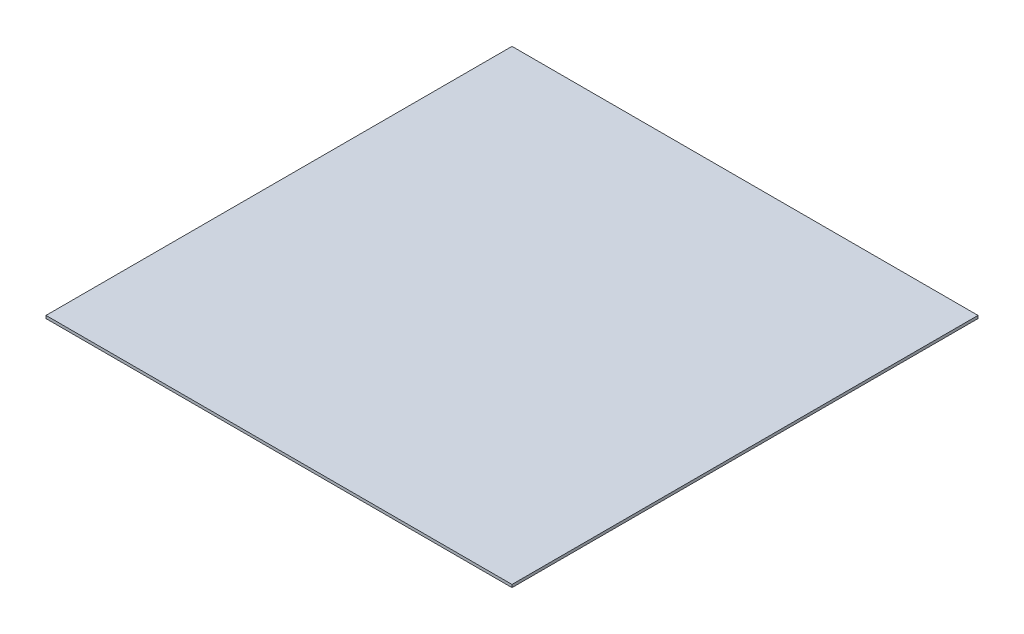
ISO-10303-21;
HEADER;
FILE_DESCRIPTION(('STEP AP214'),'2;1');
FILE_NAME('part.step','',(''),(''),'','','');
FILE_SCHEMA(('AUTOMOTIVE_DESIGN { 1 0 10303 214 1 1 1 1 }'));
ENDSEC;
DATA;
#1=APPLICATION_CONTEXT('core data for automotive mechanical design processes');
#2=APPLICATION_PROTOCOL_DEFINITION('international standard','automotive_design',2000,#1);
#3=PRODUCT_CONTEXT('',#1,'mechanical');
#4=PRODUCT('Part','Part','',(#3));
#5=PRODUCT_RELATED_PRODUCT_CATEGORY('part','',(#4));
#6=PRODUCT_DEFINITION_FORMATION('','',#4);
#7=PRODUCT_DEFINITION_CONTEXT('part definition',#1,'design');
#8=PRODUCT_DEFINITION('design','',#6,#7);
#9=PRODUCT_DEFINITION_SHAPE('','',#8);
#10=(LENGTH_UNIT() NAMED_UNIT(*) SI_UNIT(.MILLI.,.METRE.));
#11=(NAMED_UNIT(*) PLANE_ANGLE_UNIT() SI_UNIT($,.RADIAN.));
#12=(NAMED_UNIT(*) SI_UNIT($,.STERADIAN.) SOLID_ANGLE_UNIT());
#13=UNCERTAINTY_MEASURE_WITH_UNIT(LENGTH_MEASURE(1.E-05),#10,'distance_accuracy_value','');
#14=(GEOMETRIC_REPRESENTATION_CONTEXT(3) GLOBAL_UNCERTAINTY_ASSIGNED_CONTEXT((#13)) GLOBAL_UNIT_ASSIGNED_CONTEXT((#10,
#11,#12)) REPRESENTATION_CONTEXT('',''));
#15=CARTESIAN_POINT('',(0.,0.,0.));
#16=DIRECTION('',(0.,0.,1.));
#17=DIRECTION('',(1.,0.,0.));
#18=AXIS2_PLACEMENT_3D('',#15,#16,#17);
#19=CARTESIAN_POINT('',(125.,0.75,125.));
#20=DIRECTION('',(-1.,0.,0.));
#21=DIRECTION('',(0.,0.,1.));
#22=AXIS2_PLACEMENT_3D('',#19,#20,#21);
#23=PLANE('',#22);
#24=DIRECTION('',(0.,0.,-1.));
#25=VECTOR('',#24,1.);
#26=CARTESIAN_POINT('',(125.,-0.75,125.));
#27=LINE('',#26,#25);
#28=CARTESIAN_POINT('',(125.,-0.75,125.));
#29=VERTEX_POINT('',#28);
#30=CARTESIAN_POINT('',(125.,-0.75,-125.));
#31=VERTEX_POINT('',#30);
#32=EDGE_CURVE('E107',#29,#31,#27,.T.);
#33=ORIENTED_EDGE('',*,*,#32,.T.);
#34=DIRECTION('',(0.,-1.,0.));
#35=VECTOR('',#34,1.);
#36=CARTESIAN_POINT('',(125.,0.75,-125.));
#37=LINE('',#36,#35);
#38=CARTESIAN_POINT('',(125.,0.75,-125.));
#39=VERTEX_POINT('',#38);
#40=EDGE_CURVE('E11',#39,#31,#37,.T.);
#41=ORIENTED_EDGE('',*,*,#40,.F.);
#42=DIRECTION('',(0.,0.,-1.));
#43=VECTOR('',#42,1.);
#44=CARTESIAN_POINT('',(125.,0.75,125.));
#45=LINE('',#44,#43);
#46=CARTESIAN_POINT('',(125.,0.75,125.));
#47=VERTEX_POINT('',#46);
#48=EDGE_CURVE('E91',#47,#39,#45,.T.);
#49=ORIENTED_EDGE('',*,*,#48,.F.);
#50=DIRECTION('',(0.,-1.,0.));
#51=VECTOR('',#50,1.);
#52=CARTESIAN_POINT('',(125.,0.75,125.));
#53=LINE('',#52,#51);
#54=EDGE_CURVE('E103',#47,#29,#53,.T.);
#55=ORIENTED_EDGE('',*,*,#54,.T.);
#56=EDGE_LOOP('',(#33,#41,#49,#55));
#57=FACE_BOUND('',#56,.T.);
#58=ADVANCED_FACE('F39',(#57),#23,.F.);
#59=CARTESIAN_POINT('',(-125.,0.75,-125.));
#60=DIRECTION('',(0.,0.,1.));
#61=DIRECTION('',(1.,0.,0.));
#62=AXIS2_PLACEMENT_3D('',#59,#60,#61);
#63=PLANE('',#62);
#64=DIRECTION('',(-1.,0.,0.));
#65=VECTOR('',#64,1.);
#66=CARTESIAN_POINT('',(-125.,-0.75,-125.));
#67=LINE('',#66,#65);
#68=CARTESIAN_POINT('',(-125.,-0.75,-125.));
#69=VERTEX_POINT('',#68);
#70=EDGE_CURVE('E96',#31,#69,#67,.T.);
#71=ORIENTED_EDGE('',*,*,#70,.T.);
#72=DIRECTION('',(0.,-1.,0.));
#73=VECTOR('',#72,1.);
#74=CARTESIAN_POINT('',(-125.,0.75,-125.));
#75=LINE('',#74,#73);
#76=CARTESIAN_POINT('',(-125.,0.75,-125.));
#77=VERTEX_POINT('',#76);
#78=EDGE_CURVE('E48',#77,#69,#75,.T.);
#79=ORIENTED_EDGE('',*,*,#78,.F.);
#80=DIRECTION('',(-1.,0.,0.));
#81=VECTOR('',#80,1.);
#82=CARTESIAN_POINT('',(-125.,0.75,-125.));
#83=LINE('',#82,#81);
#84=EDGE_CURVE('E86',#39,#77,#83,.T.);
#85=ORIENTED_EDGE('',*,*,#84,.F.);
#86=ORIENTED_EDGE('',*,*,#40,.T.);
#87=EDGE_LOOP('',(#71,#79,#85,#86));
#88=FACE_BOUND('',#87,.T.);
#89=ADVANCED_FACE('F95',(#88),#63,.F.);
#90=CARTESIAN_POINT('',(-125.,0.75,125.));
#91=DIRECTION('',(1.,0.,0.));
#92=DIRECTION('',(0.,0.,-1.));
#93=AXIS2_PLACEMENT_3D('',#90,#91,#92);
#94=PLANE('',#93);
#95=DIRECTION('',(0.,0.,1.));
#96=VECTOR('',#95,1.);
#97=CARTESIAN_POINT('',(-125.,-0.75,125.));
#98=LINE('',#97,#96);
#99=CARTESIAN_POINT('',(-125.,-0.75,125.));
#100=VERTEX_POINT('',#99);
#101=EDGE_CURVE('E73',#69,#100,#98,.T.);
#102=ORIENTED_EDGE('',*,*,#101,.T.);
#103=DIRECTION('',(0.,-1.,0.));
#104=VECTOR('',#103,1.);
#105=CARTESIAN_POINT('',(-125.,0.75,125.));
#106=LINE('',#105,#104);
#107=CARTESIAN_POINT('',(-125.,0.75,125.));
#108=VERTEX_POINT('',#107);
#109=EDGE_CURVE('E98',#108,#100,#106,.T.);
#110=ORIENTED_EDGE('',*,*,#109,.F.);
#111=DIRECTION('',(0.,0.,1.));
#112=VECTOR('',#111,1.);
#113=CARTESIAN_POINT('',(-125.,0.75,125.));
#114=LINE('',#113,#112);
#115=EDGE_CURVE('E89',#77,#108,#114,.T.);
#116=ORIENTED_EDGE('',*,*,#115,.F.);
#117=ORIENTED_EDGE('',*,*,#78,.T.);
#118=EDGE_LOOP('',(#102,#110,#116,#117));
#119=FACE_BOUND('',#118,.T.);
#120=ADVANCED_FACE('F99',(#119),#94,.F.);
#121=CARTESIAN_POINT('',(-125.,0.75,125.));
#122=DIRECTION('',(0.,0.,-1.));
#123=DIRECTION('',(-1.,0.,0.));
#124=AXIS2_PLACEMENT_3D('',#121,#122,#123);
#125=PLANE('',#124);
#126=DIRECTION('',(1.,0.,0.));
#127=VECTOR('',#126,1.);
#128=CARTESIAN_POINT('',(-125.,-0.75,125.));
#129=LINE('',#128,#127);
#130=EDGE_CURVE('E79',#100,#29,#129,.T.);
#131=ORIENTED_EDGE('',*,*,#130,.T.);
#132=ORIENTED_EDGE('',*,*,#54,.F.);
#133=DIRECTION('',(1.,0.,0.));
#134=VECTOR('',#133,1.);
#135=CARTESIAN_POINT('',(-125.,0.75,125.));
#136=LINE('',#135,#134);
#137=EDGE_CURVE('E56',#108,#47,#136,.T.);
#138=ORIENTED_EDGE('',*,*,#137,.F.);
#139=ORIENTED_EDGE('',*,*,#109,.T.);
#140=EDGE_LOOP('',(#131,#132,#138,#139));
#141=FACE_BOUND('',#140,.T.);
#142=ADVANCED_FACE('F120',(#141),#125,.F.);
#143=CARTESIAN_POINT('',(0.,0.75,0.));
#144=DIRECTION('',(0.,-1.,0.));
#145=DIRECTION('',(0.,0.,-1.));
#146=AXIS2_PLACEMENT_3D('',#143,#144,#145);
#147=PLANE('',#146);
#148=ORIENTED_EDGE('',*,*,#48,.T.);
#149=ORIENTED_EDGE('',*,*,#84,.T.);
#150=ORIENTED_EDGE('',*,*,#115,.T.);
#151=ORIENTED_EDGE('',*,*,#137,.T.);
#152=EDGE_LOOP('',(#148,#149,#150,#151));
#153=FACE_BOUND('',#152,.T.);
#154=ADVANCED_FACE('F87',(#153),#147,.F.);
#155=CARTESIAN_POINT('',(0.,-0.75,0.));
#156=DIRECTION('',(0.,-1.,0.));
#157=DIRECTION('',(0.,0.,-1.));
#158=AXIS2_PLACEMENT_3D('',#155,#156,#157);
#159=PLANE('',#158);
#160=ORIENTED_EDGE('',*,*,#32,.F.);
#161=ORIENTED_EDGE('',*,*,#130,.F.);
#162=ORIENTED_EDGE('',*,*,#101,.F.);
#163=ORIENTED_EDGE('',*,*,#70,.F.);
#164=EDGE_LOOP('',(#160,#161,#162,#163));
#165=FACE_BOUND('',#164,.T.);
#166=ADVANCED_FACE('F123',(#165),#159,.T.);
#167=CLOSED_SHELL('',(#58,#89,#120,#142,#154,#166));
#168=MANIFOLD_SOLID_BREP('B2',#167);
#169=ADVANCED_BREP_SHAPE_REPRESENTATION('',(#18,#168),#14);
#170=SHAPE_DEFINITION_REPRESENTATION(#9,#169);
ENDSEC;
END-ISO-10303-21;
